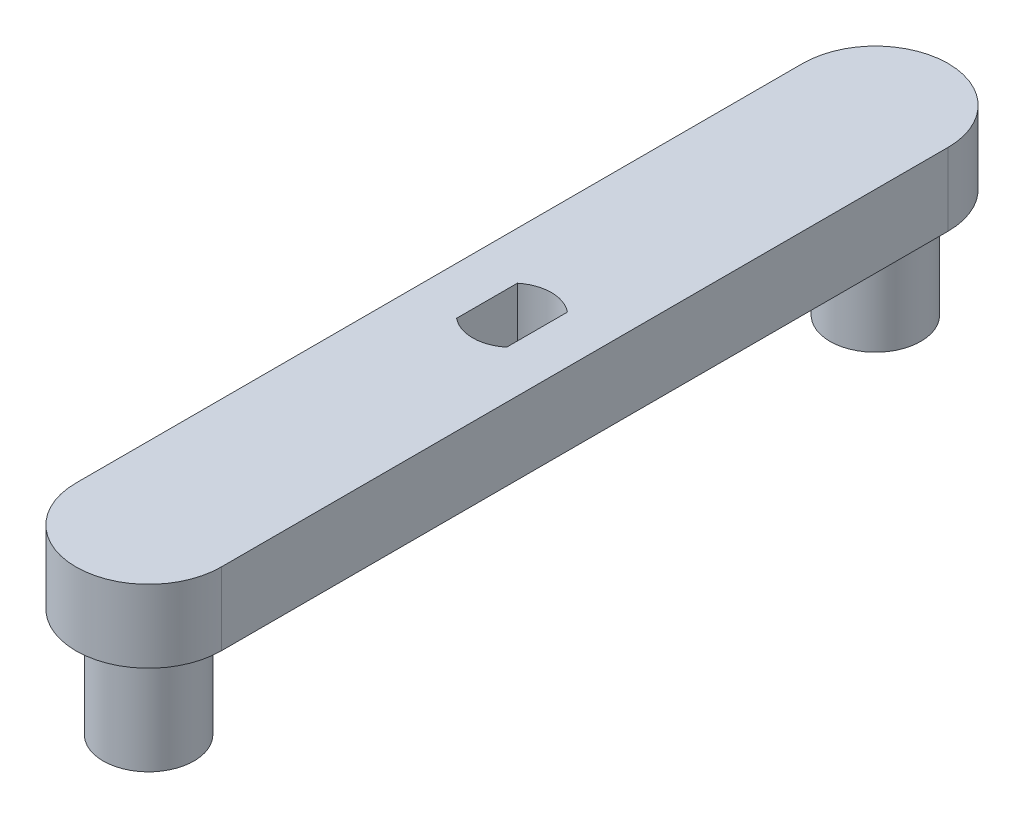
ISO-10303-21;
HEADER;
FILE_DESCRIPTION(('STEP AP214'),'2;1');
FILE_NAME('part.step','',(''),(''),'','','');
FILE_SCHEMA(('AUTOMOTIVE_DESIGN { 1 0 10303 214 1 1 1 1 }'));
ENDSEC;
DATA;
#1=APPLICATION_CONTEXT('core data for automotive mechanical design processes');
#2=APPLICATION_PROTOCOL_DEFINITION('international standard','automotive_design',2000,#1);
#3=PRODUCT_CONTEXT('',#1,'mechanical');
#4=PRODUCT('Part','Part','',(#3));
#5=PRODUCT_RELATED_PRODUCT_CATEGORY('part','',(#4));
#6=PRODUCT_DEFINITION_FORMATION('','',#4);
#7=PRODUCT_DEFINITION_CONTEXT('part definition',#1,'design');
#8=PRODUCT_DEFINITION('design','',#6,#7);
#9=PRODUCT_DEFINITION_SHAPE('','',#8);
#10=(LENGTH_UNIT() NAMED_UNIT(*) SI_UNIT(.MILLI.,.METRE.));
#11=(NAMED_UNIT(*) PLANE_ANGLE_UNIT() SI_UNIT($,.RADIAN.));
#12=(NAMED_UNIT(*) SI_UNIT($,.STERADIAN.) SOLID_ANGLE_UNIT());
#13=UNCERTAINTY_MEASURE_WITH_UNIT(LENGTH_MEASURE(1.E-05),#10,'distance_accuracy_value','');
#14=(GEOMETRIC_REPRESENTATION_CONTEXT(3) GLOBAL_UNCERTAINTY_ASSIGNED_CONTEXT((#13)) GLOBAL_UNIT_ASSIGNED_CONTEXT((#10,
#11,#12)) REPRESENTATION_CONTEXT('',''));
#15=CARTESIAN_POINT('',(0.,0.,0.));
#16=DIRECTION('',(0.,0.,1.));
#17=DIRECTION('',(1.,0.,0.));
#18=AXIS2_PLACEMENT_3D('',#15,#16,#17);
#19=CARTESIAN_POINT('',(0.,5.08,25.4));
#20=DIRECTION('',(0.,-1.,0.));
#21=DIRECTION('',(0.,0.,-1.));
#22=AXIS2_PLACEMENT_3D('',#19,#20,#21);
#23=CYLINDRICAL_SURFACE('',#22,5.08);
#24=CARTESIAN_POINT('',(0.,0.,25.4));
#25=DIRECTION('',(0.,1.,0.));
#26=DIRECTION('',(0.,0.,1.));
#27=AXIS2_PLACEMENT_3D('',#24,#25,#26);
#28=CIRCLE('',#27,5.08);
#29=CARTESIAN_POINT('',(-5.08,0.,25.4));
#30=VERTEX_POINT('',#29);
#31=CARTESIAN_POINT('',(5.08,0.,25.4));
#32=VERTEX_POINT('',#31);
#33=EDGE_CURVE('E139',#30,#32,#28,.T.);
#34=ORIENTED_EDGE('',*,*,#33,.T.);
#35=DIRECTION('',(0.,-1.,0.));
#36=VECTOR('',#35,1.);
#37=CARTESIAN_POINT('',(5.08,5.08,25.4));
#38=LINE('',#37,#36);
#39=CARTESIAN_POINT('',(5.08,5.08,25.4));
#40=VERTEX_POINT('',#39);
#41=EDGE_CURVE('E166',#40,#32,#38,.T.);
#42=ORIENTED_EDGE('',*,*,#41,.F.);
#43=CARTESIAN_POINT('',(0.,5.08,25.4));
#44=DIRECTION('',(0.,1.,0.));
#45=DIRECTION('',(0.,0.,1.));
#46=AXIS2_PLACEMENT_3D('',#43,#44,#45);
#47=CIRCLE('',#46,5.08);
#48=CARTESIAN_POINT('',(-5.08,5.08,25.4));
#49=VERTEX_POINT('',#48);
#50=EDGE_CURVE('E140',#49,#40,#47,.T.);
#51=ORIENTED_EDGE('',*,*,#50,.F.);
#52=DIRECTION('',(0.,-1.,0.));
#53=VECTOR('',#52,1.);
#54=CARTESIAN_POINT('',(-5.08,5.08,25.4));
#55=LINE('',#54,#53);
#56=EDGE_CURVE('E150',#49,#30,#55,.T.);
#57=ORIENTED_EDGE('',*,*,#56,.T.);
#58=EDGE_LOOP('',(#34,#42,#51,#57));
#59=FACE_BOUND('',#58,.T.);
#60=ADVANCED_FACE('F33',(#59),#23,.T.);
#61=CARTESIAN_POINT('',(5.08,5.08,25.4));
#62=DIRECTION('',(-1.,0.,0.));
#63=DIRECTION('',(0.,0.,1.));
#64=AXIS2_PLACEMENT_3D('',#61,#62,#63);
#65=PLANE('',#64);
#66=DIRECTION('',(0.,0.,-1.));
#67=VECTOR('',#66,1.);
#68=CARTESIAN_POINT('',(5.08,0.,25.4));
#69=LINE('',#68,#67);
#70=CARTESIAN_POINT('',(5.08,0.,-25.4));
#71=VERTEX_POINT('',#70);
#72=EDGE_CURVE('E153',#32,#71,#69,.T.);
#73=ORIENTED_EDGE('',*,*,#72,.T.);
#74=DIRECTION('',(0.,-1.,0.));
#75=VECTOR('',#74,1.);
#76=CARTESIAN_POINT('',(5.08,5.08,-25.4));
#77=LINE('',#76,#75);
#78=CARTESIAN_POINT('',(5.08,5.08,-25.4));
#79=VERTEX_POINT('',#78);
#80=EDGE_CURVE('E163',#79,#71,#77,.T.);
#81=ORIENTED_EDGE('',*,*,#80,.F.);
#82=DIRECTION('',(0.,0.,-1.));
#83=VECTOR('',#82,1.);
#84=CARTESIAN_POINT('',(5.08,5.08,25.4));
#85=LINE('',#84,#83);
#86=EDGE_CURVE('E143',#40,#79,#85,.T.);
#87=ORIENTED_EDGE('',*,*,#86,.F.);
#88=ORIENTED_EDGE('',*,*,#41,.T.);
#89=EDGE_LOOP('',(#73,#81,#87,#88));
#90=FACE_BOUND('',#89,.T.);
#91=ADVANCED_FACE('F193',(#90),#65,.F.);
#92=CARTESIAN_POINT('',(0.,5.08,-25.4));
#93=DIRECTION('',(0.,-1.,0.));
#94=DIRECTION('',(0.,0.,-1.));
#95=AXIS2_PLACEMENT_3D('',#92,#93,#94);
#96=CYLINDRICAL_SURFACE('',#95,5.08);
#97=CARTESIAN_POINT('',(0.,0.,-25.4));
#98=DIRECTION('',(0.,1.,0.));
#99=DIRECTION('',(0.,0.,1.));
#100=AXIS2_PLACEMENT_3D('',#97,#98,#99);
#101=CIRCLE('',#100,5.08);
#102=CARTESIAN_POINT('',(-5.08,0.,-25.4));
#103=VERTEX_POINT('',#102);
#104=EDGE_CURVE('E155',#71,#103,#101,.T.);
#105=ORIENTED_EDGE('',*,*,#104,.T.);
#106=DIRECTION('',(0.,-1.,0.));
#107=VECTOR('',#106,1.);
#108=CARTESIAN_POINT('',(-5.08,5.08,-25.4));
#109=LINE('',#108,#107);
#110=CARTESIAN_POINT('',(-5.08,5.08,-25.4));
#111=VERTEX_POINT('',#110);
#112=EDGE_CURVE('E160',#111,#103,#109,.T.);
#113=ORIENTED_EDGE('',*,*,#112,.F.);
#114=CARTESIAN_POINT('',(0.,5.08,-25.4));
#115=DIRECTION('',(0.,1.,0.));
#116=DIRECTION('',(0.,0.,1.));
#117=AXIS2_PLACEMENT_3D('',#114,#115,#116);
#118=CIRCLE('',#117,5.08);
#119=EDGE_CURVE('E146',#79,#111,#118,.T.);
#120=ORIENTED_EDGE('',*,*,#119,.F.);
#121=ORIENTED_EDGE('',*,*,#80,.T.);
#122=EDGE_LOOP('',(#105,#113,#120,#121));
#123=FACE_BOUND('',#122,.T.);
#124=ADVANCED_FACE('F190',(#123),#96,.T.);
#125=CARTESIAN_POINT('',(-5.08,5.08,-25.4));
#126=DIRECTION('',(1.,0.,0.));
#127=DIRECTION('',(0.,0.,-1.));
#128=AXIS2_PLACEMENT_3D('',#125,#126,#127);
#129=PLANE('',#128);
#130=DIRECTION('',(0.,0.,1.));
#131=VECTOR('',#130,1.);
#132=CARTESIAN_POINT('',(-5.08,0.,-25.4));
#133=LINE('',#132,#131);
#134=EDGE_CURVE('E144',#103,#30,#133,.T.);
#135=ORIENTED_EDGE('',*,*,#134,.T.);
#136=ORIENTED_EDGE('',*,*,#56,.F.);
#137=DIRECTION('',(0.,0.,1.));
#138=VECTOR('',#137,1.);
#139=CARTESIAN_POINT('',(-5.08,5.08,-25.4));
#140=LINE('',#139,#138);
#141=EDGE_CURVE('E148',#111,#49,#140,.T.);
#142=ORIENTED_EDGE('',*,*,#141,.F.);
#143=ORIENTED_EDGE('',*,*,#112,.T.);
#144=EDGE_LOOP('',(#135,#136,#142,#143));
#145=FACE_BOUND('',#144,.T.);
#146=ADVANCED_FACE('F186',(#145),#129,.F.);
#147=CARTESIAN_POINT('',(0.,5.08,25.4));
#148=DIRECTION('',(0.,1.,0.));
#149=DIRECTION('',(0.,0.,1.));
#150=AXIS2_PLACEMENT_3D('',#147,#148,#149);
#151=PLANE('',#150);
#152=CARTESIAN_POINT('',(0.,5.08,0.));
#153=DIRECTION('',(0.,1.,0.));
#154=DIRECTION('',(0.,0.,1.));
#155=AXIS2_PLACEMENT_3D('',#152,#153,#154);
#156=CIRCLE('',#155,2.75);
#157=CARTESIAN_POINT('',(-1.75,5.08,2.12132034355964));
#158=VERTEX_POINT('',#157);
#159=CARTESIAN_POINT('',(1.75,5.08,2.12132034355964));
#160=VERTEX_POINT('',#159);
#161=EDGE_CURVE('E47',#158,#160,#156,.T.);
#162=ORIENTED_EDGE('',*,*,#161,.F.);
#163=DIRECTION('',(0.,0.,1.));
#164=VECTOR('',#163,1.);
#165=CARTESIAN_POINT('',(-1.75,5.08,-2.12132034355964));
#166=LINE('',#165,#164);
#167=CARTESIAN_POINT('',(-1.75,5.08,-2.12132034355964));
#168=VERTEX_POINT('',#167);
#169=EDGE_CURVE('E105',#168,#158,#166,.T.);
#170=ORIENTED_EDGE('',*,*,#169,.F.);
#171=CARTESIAN_POINT('',(0.,5.08,0.));
#172=DIRECTION('',(0.,1.,0.));
#173=DIRECTION('',(0.,0.,1.));
#174=AXIS2_PLACEMENT_3D('',#171,#172,#173);
#175=CIRCLE('',#174,2.75);
#176=CARTESIAN_POINT('',(1.75,5.08,-2.12132034355964));
#177=VERTEX_POINT('',#176);
#178=EDGE_CURVE('E125',#177,#168,#175,.T.);
#179=ORIENTED_EDGE('',*,*,#178,.F.);
#180=DIRECTION('',(0.,0.,-1.));
#181=VECTOR('',#180,1.);
#182=CARTESIAN_POINT('',(1.75,5.08,-2.12132034355964));
#183=LINE('',#182,#181);
#184=EDGE_CURVE('E119',#160,#177,#183,.T.);
#185=ORIENTED_EDGE('',*,*,#184,.F.);
#186=EDGE_LOOP('',(#162,#170,#179,#185));
#187=FACE_BOUND('',#186,.T.);
#188=ORIENTED_EDGE('',*,*,#50,.T.);
#189=ORIENTED_EDGE('',*,*,#86,.T.);
#190=ORIENTED_EDGE('',*,*,#119,.T.);
#191=ORIENTED_EDGE('',*,*,#141,.T.);
#192=EDGE_LOOP('',(#188,#189,#190,#191));
#193=FACE_BOUND('',#192,.T.);
#194=ADVANCED_FACE('F175',(#187,#193),#151,.T.);
#195=CARTESIAN_POINT('',(0.,0.,25.4));
#196=DIRECTION('',(0.,1.,0.));
#197=DIRECTION('',(0.,0.,1.));
#198=AXIS2_PLACEMENT_3D('',#195,#196,#197);
#199=PLANE('',#198);
#200=DIRECTION('',(0.,0.,-1.));
#201=VECTOR('',#200,1.);
#202=CARTESIAN_POINT('',(-1.75,0.,-2.12132034355964));
#203=LINE('',#202,#201);
#204=CARTESIAN_POINT('',(-1.75,0.,2.12132034355964));
#205=VERTEX_POINT('',#204);
#206=CARTESIAN_POINT('',(-1.75,0.,-2.12132034355964));
#207=VERTEX_POINT('',#206);
#208=EDGE_CURVE('E117',#205,#207,#203,.T.);
#209=ORIENTED_EDGE('',*,*,#208,.F.);
#210=CARTESIAN_POINT('',(0.,0.,0.));
#211=DIRECTION('',(0.,1.,0.));
#212=DIRECTION('',(0.,0.,1.));
#213=AXIS2_PLACEMENT_3D('',#210,#211,#212);
#214=CIRCLE('',#213,2.75);
#215=CARTESIAN_POINT('',(1.75,0.,2.12132034355964));
#216=VERTEX_POINT('',#215);
#217=EDGE_CURVE('E99',#216,#205,#214,.F.);
#218=ORIENTED_EDGE('',*,*,#217,.F.);
#219=DIRECTION('',(0.,0.,1.));
#220=VECTOR('',#219,1.);
#221=CARTESIAN_POINT('',(1.75,0.,-2.12132034355964));
#222=LINE('',#221,#220);
#223=CARTESIAN_POINT('',(1.75,0.,-2.12132034355964));
#224=VERTEX_POINT('',#223);
#225=EDGE_CURVE('E108',#224,#216,#222,.T.);
#226=ORIENTED_EDGE('',*,*,#225,.F.);
#227=CARTESIAN_POINT('',(0.,0.,0.));
#228=DIRECTION('',(0.,1.,0.));
#229=DIRECTION('',(0.,0.,1.));
#230=AXIS2_PLACEMENT_3D('',#227,#228,#229);
#231=CIRCLE('',#230,2.75);
#232=EDGE_CURVE('E55',#207,#224,#231,.F.);
#233=ORIENTED_EDGE('',*,*,#232,.F.);
#234=EDGE_LOOP('',(#209,#218,#226,#233));
#235=FACE_BOUND('',#234,.T.);
#236=CARTESIAN_POINT('',(0.,0.,-25.4));
#237=DIRECTION('',(0.,1.,0.));
#238=DIRECTION('',(0.,0.,1.));
#239=AXIS2_PLACEMENT_3D('',#236,#237,#238);
#240=CIRCLE('',#239,3.175);
#241=CARTESIAN_POINT('',(0.,0.,-22.225));
#242=VERTEX_POINT('',#241);
#243=EDGE_CURVE('E11',#242,#242,#240,.F.);
#244=ORIENTED_EDGE('',*,*,#243,.F.);
#245=EDGE_LOOP('',(#244));
#246=FACE_BOUND('',#245,.T.);
#247=CARTESIAN_POINT('',(0.,0.,25.4));
#248=DIRECTION('',(0.,1.,0.));
#249=DIRECTION('',(0.,0.,1.));
#250=AXIS2_PLACEMENT_3D('',#247,#248,#249);
#251=CIRCLE('',#250,3.175);
#252=CARTESIAN_POINT('',(0.,0.,28.575));
#253=VERTEX_POINT('',#252);
#254=EDGE_CURVE('E40',#253,#253,#251,.F.);
#255=ORIENTED_EDGE('',*,*,#254,.F.);
#256=EDGE_LOOP('',(#255));
#257=FACE_BOUND('',#256,.T.);
#258=ORIENTED_EDGE('',*,*,#33,.F.);
#259=ORIENTED_EDGE('',*,*,#134,.F.);
#260=ORIENTED_EDGE('',*,*,#104,.F.);
#261=ORIENTED_EDGE('',*,*,#72,.F.);
#262=EDGE_LOOP('',(#258,#259,#260,#261));
#263=FACE_BOUND('',#262,.T.);
#264=ADVANCED_FACE('F114',(#235,#246,#257,#263),#199,.F.);
#265=CARTESIAN_POINT('',(0.,-7.62,25.4));
#266=DIRECTION('',(0.,1.,0.));
#267=DIRECTION('',(0.,0.,1.));
#268=AXIS2_PLACEMENT_3D('',#265,#266,#267);
#269=CYLINDRICAL_SURFACE('',#268,3.175);
#270=CARTESIAN_POINT('',(0.,-7.62,25.4));
#271=DIRECTION('',(0.,-1.,0.));
#272=DIRECTION('',(0.,0.,-1.));
#273=AXIS2_PLACEMENT_3D('',#270,#271,#272);
#274=CIRCLE('',#273,3.175);
#275=CARTESIAN_POINT('',(0.,-7.62,28.575));
#276=VERTEX_POINT('',#275);
#277=EDGE_CURVE('E136',#276,#276,#274,.T.);
#278=CARTESIAN_POINT('',(0.,-7.62,28.575));
#279=CARTESIAN_POINT('',(0.,-7.540625,28.575));
#280=CARTESIAN_POINT('',(0.,-7.46125,28.575));
#281=CARTESIAN_POINT('',(0.,-7.3025,28.575));
#282=CARTESIAN_POINT('',(0.,-7.223125,28.575));
#283=CARTESIAN_POINT('',(0.,-7.064375,28.575));
#284=CARTESIAN_POINT('',(0.,-6.985,28.575));
#285=CARTESIAN_POINT('',(0.,-6.82625,28.575));
#286=CARTESIAN_POINT('',(0.,-6.746875,28.575));
#287=CARTESIAN_POINT('',(0.,-6.588125,28.575));
#288=CARTESIAN_POINT('',(0.,-6.50875,28.575));
#289=CARTESIAN_POINT('',(0.,-6.35,28.575));
#290=CARTESIAN_POINT('',(0.,-6.270625,28.575));
#291=CARTESIAN_POINT('',(0.,-6.111875,28.575));
#292=CARTESIAN_POINT('',(0.,-6.0325,28.575));
#293=CARTESIAN_POINT('',(0.,-5.87375,28.575));
#294=CARTESIAN_POINT('',(0.,-5.794375,28.575));
#295=CARTESIAN_POINT('',(0.,-5.635625,28.575));
#296=CARTESIAN_POINT('',(0.,-5.55625,28.575));
#297=CARTESIAN_POINT('',(0.,-5.3975,28.575));
#298=CARTESIAN_POINT('',(0.,-5.318125,28.575));
#299=CARTESIAN_POINT('',(0.,-5.159375,28.575));
#300=CARTESIAN_POINT('',(0.,-5.08,28.575));
#301=CARTESIAN_POINT('',(0.,-4.92125,28.575));
#302=CARTESIAN_POINT('',(0.,-4.841875,28.575));
#303=CARTESIAN_POINT('',(0.,-4.683125,28.575));
#304=CARTESIAN_POINT('',(0.,-4.60375,28.575));
#305=CARTESIAN_POINT('',(0.,-4.445,28.575));
#306=CARTESIAN_POINT('',(0.,-4.365625,28.575));
#307=CARTESIAN_POINT('',(0.,-4.206875,28.575));
#308=CARTESIAN_POINT('',(0.,-4.1275,28.575));
#309=CARTESIAN_POINT('',(0.,-3.96875,28.575));
#310=CARTESIAN_POINT('',(0.,-3.889375,28.575));
#311=CARTESIAN_POINT('',(0.,-3.730625,28.575));
#312=CARTESIAN_POINT('',(0.,-3.65125,28.575));
#313=CARTESIAN_POINT('',(0.,-3.4925,28.575));
#314=CARTESIAN_POINT('',(0.,-3.413125,28.575));
#315=CARTESIAN_POINT('',(0.,-3.254375,28.575));
#316=CARTESIAN_POINT('',(0.,-3.175,28.575));
#317=CARTESIAN_POINT('',(0.,-3.01625,28.575));
#318=CARTESIAN_POINT('',(0.,-2.936875,28.575));
#319=CARTESIAN_POINT('',(0.,-2.778125,28.575));
#320=CARTESIAN_POINT('',(0.,-2.69875,28.575));
#321=CARTESIAN_POINT('',(0.,-2.54,28.575));
#322=CARTESIAN_POINT('',(0.,-2.460625,28.575));
#323=CARTESIAN_POINT('',(0.,-2.301875,28.575));
#324=CARTESIAN_POINT('',(0.,-2.2225,28.575));
#325=CARTESIAN_POINT('',(0.,-2.06375,28.575));
#326=CARTESIAN_POINT('',(0.,-1.984375,28.575));
#327=CARTESIAN_POINT('',(0.,-1.825625,28.575));
#328=CARTESIAN_POINT('',(0.,-1.74625,28.575));
#329=CARTESIAN_POINT('',(0.,-1.5875,28.575));
#330=CARTESIAN_POINT('',(0.,-1.508125,28.575));
#331=CARTESIAN_POINT('',(0.,-1.349375,28.575));
#332=CARTESIAN_POINT('',(0.,-1.27,28.575));
#333=CARTESIAN_POINT('',(0.,-1.11125,28.575));
#334=CARTESIAN_POINT('',(0.,-1.031875,28.575));
#335=CARTESIAN_POINT('',(0.,-0.873125,28.575));
#336=CARTESIAN_POINT('',(0.,-0.79375,28.575));
#337=CARTESIAN_POINT('',(0.,-0.635,28.575));
#338=CARTESIAN_POINT('',(0.,-0.555625,28.575));
#339=CARTESIAN_POINT('',(0.,-0.396875,28.575));
#340=CARTESIAN_POINT('',(0.,-0.3175,28.575));
#341=CARTESIAN_POINT('',(0.,-0.15875,28.575));
#342=CARTESIAN_POINT('',(0.,-0.0793749999999999,28.575));
#343=CARTESIAN_POINT('',(0.,0.,28.575));
#344=B_SPLINE_CURVE_WITH_KNOTS('',3,(#278,#279,#280,#281,#282,#283,#284,#285,#286,#287,#288,
#289,#290,#291,#292,#293,#294,#295,#296,#297,#298,#299,#300,#301,#302,#303,#304,#305,#306,#307,
#308,#309,#310,#311,#312,#313,#314,#315,#316,#317,#318,#319,#320,#321,#322,#323,#324,#325,#326,
#327,#328,#329,#330,#331,#332,#333,#334,#335,#336,#337,#338,#339,#340,#341,#342,#343),
.UNSPECIFIED.,.F.,.F.,(4,2,2,2,2,2,2,2,2,2,2,2,2,2,2,2,2,2,2,2,2,2,2,2,2,2,2,2,2,2,2,2,4),(0.,
0.238125,0.47625,0.714375000000001,0.9525,1.190625,1.42875,1.666875,1.905,2.143125,2.38125,
2.619375,2.8575,3.095625,3.33375,3.571875,3.81,4.048125,4.28625,4.524375,4.7625,5.000625,
5.23875,5.476875,5.715,5.953125,6.19125,6.429375,6.6675,6.905625,7.14375,7.381875,7.62),.UNSPECIFIED.);
#345=EDGE_CURVE('BSEAM171',#276,#253,#344,.T.);
#346=ORIENTED_EDGE('',*,*,#277,.F.);
#347=ORIENTED_EDGE('',*,*,#254,.T.);
#348=ORIENTED_EDGE('',*,*,#345,.T.);
#349=ORIENTED_EDGE('',*,*,#345,.F.);
#350=EDGE_LOOP('',(#346,#348,#347,#349));
#351=FACE_BOUND('',#350,.T.);
#352=ADVANCED_FACE('F171',(#351),#269,.T.);
#353=CARTESIAN_POINT('',(0.,-7.62,25.4));
#354=DIRECTION('',(0.,-1.,0.));
#355=DIRECTION('',(0.,0.,-1.));
#356=AXIS2_PLACEMENT_3D('',#353,#354,#355);
#357=PLANE('',#356);
#358=ORIENTED_EDGE('',*,*,#277,.T.);
#359=EDGE_LOOP('',(#358));
#360=FACE_BOUND('',#359,.T.);
#361=ADVANCED_FACE('F227',(#360),#357,.T.);
#362=CARTESIAN_POINT('',(0.,-7.62,-25.4));
#363=DIRECTION('',(0.,1.,0.));
#364=DIRECTION('',(0.,0.,1.));
#365=AXIS2_PLACEMENT_3D('',#362,#363,#364);
#366=CYLINDRICAL_SURFACE('',#365,3.175);
#367=CARTESIAN_POINT('',(0.,-7.62,-25.4));
#368=DIRECTION('',(0.,-1.,0.));
#369=DIRECTION('',(0.,0.,-1.));
#370=AXIS2_PLACEMENT_3D('',#367,#368,#369);
#371=CIRCLE('',#370,3.175);
#372=CARTESIAN_POINT('',(0.,-7.62,-22.225));
#373=VERTEX_POINT('',#372);
#374=EDGE_CURVE('E111',#373,#373,#371,.T.);
#375=CARTESIAN_POINT('',(0.,-7.62,-22.225));
#376=CARTESIAN_POINT('',(0.,-7.540625,-22.225));
#377=CARTESIAN_POINT('',(0.,-7.46125,-22.225));
#378=CARTESIAN_POINT('',(0.,-7.3025,-22.225));
#379=CARTESIAN_POINT('',(0.,-7.223125,-22.225));
#380=CARTESIAN_POINT('',(0.,-7.064375,-22.225));
#381=CARTESIAN_POINT('',(0.,-6.985,-22.225));
#382=CARTESIAN_POINT('',(0.,-6.82625,-22.225));
#383=CARTESIAN_POINT('',(0.,-6.746875,-22.225));
#384=CARTESIAN_POINT('',(0.,-6.588125,-22.225));
#385=CARTESIAN_POINT('',(0.,-6.50875,-22.225));
#386=CARTESIAN_POINT('',(0.,-6.35,-22.225));
#387=CARTESIAN_POINT('',(0.,-6.270625,-22.225));
#388=CARTESIAN_POINT('',(0.,-6.111875,-22.225));
#389=CARTESIAN_POINT('',(0.,-6.0325,-22.225));
#390=CARTESIAN_POINT('',(0.,-5.87375,-22.225));
#391=CARTESIAN_POINT('',(0.,-5.794375,-22.225));
#392=CARTESIAN_POINT('',(0.,-5.635625,-22.225));
#393=CARTESIAN_POINT('',(0.,-5.55625,-22.225));
#394=CARTESIAN_POINT('',(0.,-5.3975,-22.225));
#395=CARTESIAN_POINT('',(0.,-5.318125,-22.225));
#396=CARTESIAN_POINT('',(0.,-5.159375,-22.225));
#397=CARTESIAN_POINT('',(0.,-5.08,-22.225));
#398=CARTESIAN_POINT('',(0.,-4.92125,-22.225));
#399=CARTESIAN_POINT('',(0.,-4.841875,-22.225));
#400=CARTESIAN_POINT('',(0.,-4.683125,-22.225));
#401=CARTESIAN_POINT('',(0.,-4.60375,-22.225));
#402=CARTESIAN_POINT('',(0.,-4.445,-22.225));
#403=CARTESIAN_POINT('',(0.,-4.365625,-22.225));
#404=CARTESIAN_POINT('',(0.,-4.206875,-22.225));
#405=CARTESIAN_POINT('',(0.,-4.1275,-22.225));
#406=CARTESIAN_POINT('',(0.,-3.96875,-22.225));
#407=CARTESIAN_POINT('',(0.,-3.889375,-22.225));
#408=CARTESIAN_POINT('',(0.,-3.730625,-22.225));
#409=CARTESIAN_POINT('',(0.,-3.65125,-22.225));
#410=CARTESIAN_POINT('',(0.,-3.4925,-22.225));
#411=CARTESIAN_POINT('',(0.,-3.413125,-22.225));
#412=CARTESIAN_POINT('',(0.,-3.254375,-22.225));
#413=CARTESIAN_POINT('',(0.,-3.175,-22.225));
#414=CARTESIAN_POINT('',(0.,-3.01625,-22.225));
#415=CARTESIAN_POINT('',(0.,-2.936875,-22.225));
#416=CARTESIAN_POINT('',(0.,-2.778125,-22.225));
#417=CARTESIAN_POINT('',(0.,-2.69875,-22.225));
#418=CARTESIAN_POINT('',(0.,-2.54,-22.225));
#419=CARTESIAN_POINT('',(0.,-2.460625,-22.225));
#420=CARTESIAN_POINT('',(0.,-2.301875,-22.225));
#421=CARTESIAN_POINT('',(0.,-2.2225,-22.225));
#422=CARTESIAN_POINT('',(0.,-2.06375,-22.225));
#423=CARTESIAN_POINT('',(0.,-1.984375,-22.225));
#424=CARTESIAN_POINT('',(0.,-1.825625,-22.225));
#425=CARTESIAN_POINT('',(0.,-1.74625,-22.225));
#426=CARTESIAN_POINT('',(0.,-1.5875,-22.225));
#427=CARTESIAN_POINT('',(0.,-1.508125,-22.225));
#428=CARTESIAN_POINT('',(0.,-1.349375,-22.225));
#429=CARTESIAN_POINT('',(0.,-1.27,-22.225));
#430=CARTESIAN_POINT('',(0.,-1.11125,-22.225));
#431=CARTESIAN_POINT('',(0.,-1.031875,-22.225));
#432=CARTESIAN_POINT('',(0.,-0.873125,-22.225));
#433=CARTESIAN_POINT('',(0.,-0.79375,-22.225));
#434=CARTESIAN_POINT('',(0.,-0.635,-22.225));
#435=CARTESIAN_POINT('',(0.,-0.555625,-22.225));
#436=CARTESIAN_POINT('',(0.,-0.396875,-22.225));
#437=CARTESIAN_POINT('',(0.,-0.3175,-22.225));
#438=CARTESIAN_POINT('',(0.,-0.15875,-22.225));
#439=CARTESIAN_POINT('',(0.,-0.0793749999999999,-22.225));
#440=CARTESIAN_POINT('',(0.,0.,-22.225));
#441=B_SPLINE_CURVE_WITH_KNOTS('',3,(#375,#376,#377,#378,#379,#380,#381,#382,#383,#384,#385,
#386,#387,#388,#389,#390,#391,#392,#393,#394,#395,#396,#397,#398,#399,#400,#401,#402,#403,#404,
#405,#406,#407,#408,#409,#410,#411,#412,#413,#414,#415,#416,#417,#418,#419,#420,#421,#422,#423,
#424,#425,#426,#427,#428,#429,#430,#431,#432,#433,#434,#435,#436,#437,#438,#439,#440),
.UNSPECIFIED.,.F.,.F.,(4,2,2,2,2,2,2,2,2,2,2,2,2,2,2,2,2,2,2,2,2,2,2,2,2,2,2,2,2,2,2,2,4),(0.,
0.238125,0.47625,0.714375000000001,0.9525,1.190625,1.42875,1.666875,1.905,2.143125,2.38125,
2.619375,2.8575,3.095625,3.33375,3.571875,3.81,4.048125,4.28625,4.524375,4.7625,5.000625,
5.23875,5.476875,5.715,5.953125,6.19125,6.429375,6.6675,6.905625,7.14375,7.381875,7.62),.UNSPECIFIED.);
#442=EDGE_CURVE('BSEAM237',#373,#242,#441,.T.);
#443=ORIENTED_EDGE('',*,*,#374,.F.);
#444=ORIENTED_EDGE('',*,*,#243,.T.);
#445=ORIENTED_EDGE('',*,*,#442,.T.);
#446=ORIENTED_EDGE('',*,*,#442,.F.);
#447=EDGE_LOOP('',(#443,#445,#444,#446));
#448=FACE_BOUND('',#447,.T.);
#449=ADVANCED_FACE('F237',(#448),#366,.T.);
#450=CARTESIAN_POINT('',(0.,-7.62,-25.4));
#451=DIRECTION('',(0.,-1.,0.));
#452=DIRECTION('',(0.,0.,-1.));
#453=AXIS2_PLACEMENT_3D('',#450,#451,#452);
#454=PLANE('',#453);
#455=ORIENTED_EDGE('',*,*,#374,.T.);
#456=EDGE_LOOP('',(#455));
#457=FACE_BOUND('',#456,.T.);
#458=ADVANCED_FACE('F247',(#457),#454,.T.);
#459=CARTESIAN_POINT('',(0.,-7.621,0.));
#460=DIRECTION('',(0.,1.,0.));
#461=DIRECTION('',(0.,0.,1.));
#462=AXIS2_PLACEMENT_3D('',#459,#460,#461);
#463=CYLINDRICAL_SURFACE('',#462,2.75);
#464=ORIENTED_EDGE('',*,*,#217,.T.);
#465=DIRECTION('',(0.,1.,0.));
#466=VECTOR('',#465,1.);
#467=CARTESIAN_POINT('',(-1.75,-7.621,2.12132034355964));
#468=LINE('',#467,#466);
#469=EDGE_CURVE('E112',#205,#158,#468,.T.);
#470=ORIENTED_EDGE('',*,*,#469,.T.);
#471=ORIENTED_EDGE('',*,*,#161,.T.);
#472=DIRECTION('',(0.,1.,0.));
#473=VECTOR('',#472,1.);
#474=CARTESIAN_POINT('',(1.75,-7.621,2.12132034355964));
#475=LINE('',#474,#473);
#476=EDGE_CURVE('E95',#216,#160,#475,.T.);
#477=ORIENTED_EDGE('',*,*,#476,.F.);
#478=EDGE_LOOP('',(#464,#470,#471,#477));
#479=FACE_BOUND('',#478,.T.);
#480=ADVANCED_FACE('F97',(#479),#463,.F.);
#481=CARTESIAN_POINT('',(-1.75,-7.621,-2.12132034355964));
#482=DIRECTION('',(-1.,0.,0.));
#483=DIRECTION('',(0.,0.,1.));
#484=AXIS2_PLACEMENT_3D('',#481,#482,#483);
#485=PLANE('',#484);
#486=ORIENTED_EDGE('',*,*,#208,.T.);
#487=DIRECTION('',(0.,1.,0.));
#488=VECTOR('',#487,1.);
#489=CARTESIAN_POINT('',(-1.75,-7.621,-2.12132034355964));
#490=LINE('',#489,#488);
#491=EDGE_CURVE('E131',#207,#168,#490,.T.);
#492=ORIENTED_EDGE('',*,*,#491,.T.);
#493=ORIENTED_EDGE('',*,*,#169,.T.);
#494=ORIENTED_EDGE('',*,*,#469,.F.);
#495=EDGE_LOOP('',(#486,#492,#493,#494));
#496=FACE_BOUND('',#495,.T.);
#497=ADVANCED_FACE('F274',(#496),#485,.F.);
#498=CARTESIAN_POINT('',(0.,-7.621,0.));
#499=DIRECTION('',(0.,1.,0.));
#500=DIRECTION('',(0.,0.,1.));
#501=AXIS2_PLACEMENT_3D('',#498,#499,#500);
#502=CYLINDRICAL_SURFACE('',#501,2.75);
#503=ORIENTED_EDGE('',*,*,#232,.T.);
#504=DIRECTION('',(0.,1.,0.));
#505=VECTOR('',#504,1.);
#506=CARTESIAN_POINT('',(1.75,-7.621,-2.12132034355964));
#507=LINE('',#506,#505);
#508=EDGE_CURVE('E104',#224,#177,#507,.T.);
#509=ORIENTED_EDGE('',*,*,#508,.T.);
#510=ORIENTED_EDGE('',*,*,#178,.T.);
#511=ORIENTED_EDGE('',*,*,#491,.F.);
#512=EDGE_LOOP('',(#503,#509,#510,#511));
#513=FACE_BOUND('',#512,.T.);
#514=ADVANCED_FACE('F283',(#513),#502,.F.);
#515=CARTESIAN_POINT('',(1.75,-7.621,-2.12132034355964));
#516=DIRECTION('',(1.,0.,0.));
#517=DIRECTION('',(0.,0.,-1.));
#518=AXIS2_PLACEMENT_3D('',#515,#516,#517);
#519=PLANE('',#518);
#520=ORIENTED_EDGE('',*,*,#225,.T.);
#521=ORIENTED_EDGE('',*,*,#476,.T.);
#522=ORIENTED_EDGE('',*,*,#184,.T.);
#523=ORIENTED_EDGE('',*,*,#508,.F.);
#524=EDGE_LOOP('',(#520,#521,#522,#523));
#525=FACE_BOUND('',#524,.T.);
#526=ADVANCED_FACE('F109',(#525),#519,.F.);
#527=CLOSED_SHELL('',(#60,#91,#124,#146,#194,#264,#352,#361,#449,#458,#480,#497,#514,#526));
#528=MANIFOLD_SOLID_BREP('B2',#527);
#529=ADVANCED_BREP_SHAPE_REPRESENTATION('',(#18,#528),#14);
#530=SHAPE_DEFINITION_REPRESENTATION(#9,#529);
ENDSEC;
END-ISO-10303-21;
